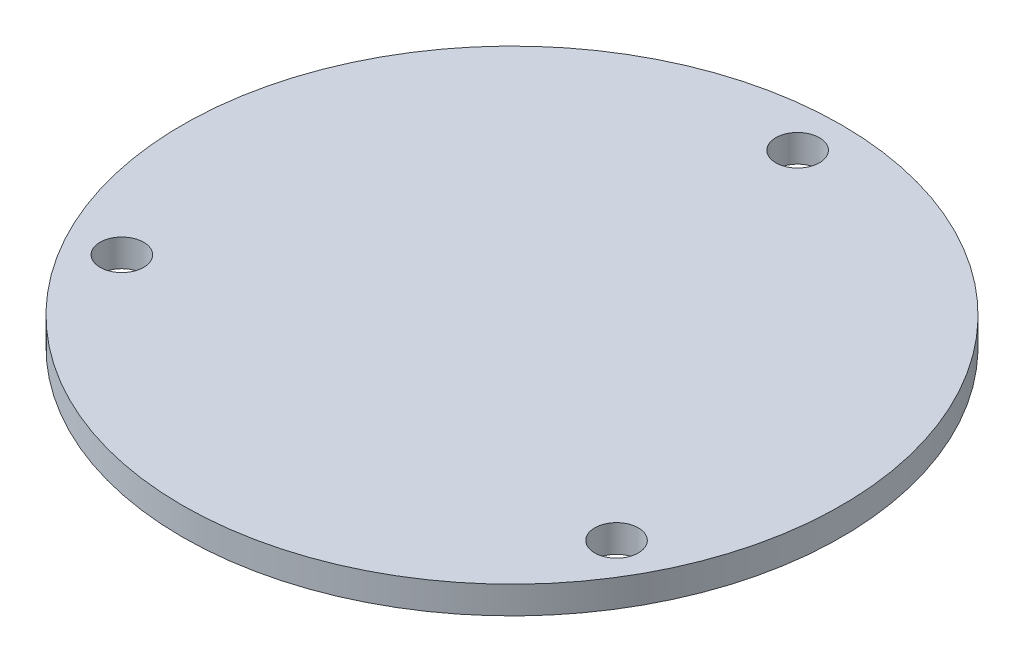
ISO-10303-21;
HEADER;
FILE_DESCRIPTION(('STEP AP214'),'2;1');
FILE_NAME('part.step','',(''),(''),'','','');
FILE_SCHEMA(('AUTOMOTIVE_DESIGN { 1 0 10303 214 1 1 1 1 }'));
ENDSEC;
DATA;
#1=APPLICATION_CONTEXT('core data for automotive mechanical design processes');
#2=APPLICATION_PROTOCOL_DEFINITION('international standard','automotive_design',2000,#1);
#3=PRODUCT_CONTEXT('',#1,'mechanical');
#4=PRODUCT('Part','Part','',(#3));
#5=PRODUCT_RELATED_PRODUCT_CATEGORY('part','',(#4));
#6=PRODUCT_DEFINITION_FORMATION('','',#4);
#7=PRODUCT_DEFINITION_CONTEXT('part definition',#1,'design');
#8=PRODUCT_DEFINITION('design','',#6,#7);
#9=PRODUCT_DEFINITION_SHAPE('','',#8);
#10=(LENGTH_UNIT() NAMED_UNIT(*) SI_UNIT(.MILLI.,.METRE.));
#11=(NAMED_UNIT(*) PLANE_ANGLE_UNIT() SI_UNIT($,.RADIAN.));
#12=(NAMED_UNIT(*) SI_UNIT($,.STERADIAN.) SOLID_ANGLE_UNIT());
#13=UNCERTAINTY_MEASURE_WITH_UNIT(LENGTH_MEASURE(1.E-05),#10,'distance_accuracy_value','');
#14=(GEOMETRIC_REPRESENTATION_CONTEXT(3) GLOBAL_UNCERTAINTY_ASSIGNED_CONTEXT((#13)) GLOBAL_UNIT_ASSIGNED_CONTEXT((#10,
#11,#12)) REPRESENTATION_CONTEXT('',''));
#15=CARTESIAN_POINT('',(0.,0.,0.));
#16=DIRECTION('',(0.,0.,1.));
#17=DIRECTION('',(1.,0.,0.));
#18=AXIS2_PLACEMENT_3D('',#15,#16,#17);
#19=CARTESIAN_POINT('',(19.05,1.5875,-19.05));
#20=DIRECTION('',(0.,1.,0.));
#21=DIRECTION('',(0.,0.,1.));
#22=AXIS2_PLACEMENT_3D('',#19,#20,#21);
#23=PLANE('',#22);
#24=CARTESIAN_POINT('',(4.75192058351891,1.5875,-10.795));
#25=DIRECTION('',(0.,1.,0.));
#26=DIRECTION('',(0.,0.,1.));
#27=AXIS2_PLACEMENT_3D('',#24,#25,#26);
#28=CIRCLE('',#27,1.25980165100016);
#29=CARTESIAN_POINT('',(4.75192058351891,1.5875,-9.53519834899987));
#30=VERTEX_POINT('',#29);
#31=EDGE_CURVE('E46',#30,#30,#28,.T.);
#32=ORIENTED_EDGE('',*,*,#31,.F.);
#33=EDGE_LOOP('',(#32));
#34=FACE_BOUND('',#33,.T.);
#35=CARTESIAN_POINT('',(19.05,1.5875,-19.05));
#36=DIRECTION('',(0.,1.,0.));
#37=DIRECTION('',(0.,0.,1.));
#38=AXIS2_PLACEMENT_3D('',#35,#36,#37);
#39=CIRCLE('',#38,19.05);
#40=CARTESIAN_POINT('',(19.05,1.5875,0.));
#41=VERTEX_POINT('',#40);
#42=EDGE_CURVE('E10',#41,#41,#39,.T.);
#43=ORIENTED_EDGE('',*,*,#42,.T.);
#44=EDGE_LOOP('',(#43));
#45=FACE_BOUND('',#44,.T.);
#46=CARTESIAN_POINT('',(19.05,1.5875,-35.56));
#47=DIRECTION('',(0.,1.,0.));
#48=DIRECTION('',(0.,0.,1.));
#49=AXIS2_PLACEMENT_3D('',#46,#47,#48);
#50=CIRCLE('',#49,1.25980165100016);
#51=CARTESIAN_POINT('',(19.05,1.5875,-34.3001983489998));
#52=VERTEX_POINT('',#51);
#53=EDGE_CURVE('E41',#52,#52,#50,.T.);
#54=ORIENTED_EDGE('',*,*,#53,.F.);
#55=EDGE_LOOP('',(#54));
#56=FACE_BOUND('',#55,.T.);
#57=CARTESIAN_POINT('',(33.3480794164811,1.5875,-10.795));
#58=DIRECTION('',(0.,1.,0.));
#59=DIRECTION('',(0.,0.,1.));
#60=AXIS2_PLACEMENT_3D('',#57,#58,#59);
#61=CIRCLE('',#60,1.25980165100017);
#62=CARTESIAN_POINT('',(33.3480794164811,1.5875,-9.53519834899988));
#63=VERTEX_POINT('',#62);
#64=EDGE_CURVE('E52',#63,#63,#61,.T.);
#65=ORIENTED_EDGE('',*,*,#64,.F.);
#66=EDGE_LOOP('',(#65));
#67=FACE_BOUND('',#66,.T.);
#68=ADVANCED_FACE('F30',(#34,#45,#56,#67),#23,.T.);
#69=CARTESIAN_POINT('',(19.05,0.,-19.05));
#70=DIRECTION('',(0.,1.,0.));
#71=DIRECTION('',(0.,0.,1.));
#72=AXIS2_PLACEMENT_3D('',#69,#70,#71);
#73=PLANE('',#72);
#74=CARTESIAN_POINT('',(19.05,0.,-19.05));
#75=DIRECTION('',(0.,1.,0.));
#76=DIRECTION('',(0.,0.,1.));
#77=AXIS2_PLACEMENT_3D('',#74,#75,#76);
#78=CIRCLE('',#77,19.05);
#79=CARTESIAN_POINT('',(19.05,0.,0.));
#80=VERTEX_POINT('',#79);
#81=EDGE_CURVE('E34',#80,#80,#78,.T.);
#82=ORIENTED_EDGE('',*,*,#81,.F.);
#83=EDGE_LOOP('',(#82));
#84=FACE_BOUND('',#83,.T.);
#85=CARTESIAN_POINT('',(19.05,0.,-35.56));
#86=DIRECTION('',(0.,1.,0.));
#87=DIRECTION('',(0.,0.,1.));
#88=AXIS2_PLACEMENT_3D('',#85,#86,#87);
#89=CIRCLE('',#88,1.25980165100016);
#90=CARTESIAN_POINT('',(19.05,0.,-34.3001983489998));
#91=VERTEX_POINT('',#90);
#92=EDGE_CURVE('E43',#91,#91,#89,.T.);
#93=ORIENTED_EDGE('',*,*,#92,.T.);
#94=EDGE_LOOP('',(#93));
#95=FACE_BOUND('',#94,.T.);
#96=CARTESIAN_POINT('',(4.75192058351891,0.,-10.795));
#97=DIRECTION('',(0.,1.,0.));
#98=DIRECTION('',(0.,0.,1.));
#99=AXIS2_PLACEMENT_3D('',#96,#97,#98);
#100=CIRCLE('',#99,1.25980165100016);
#101=CARTESIAN_POINT('',(4.75192058351891,0.,-9.53519834899987));
#102=VERTEX_POINT('',#101);
#103=EDGE_CURVE('E49',#102,#102,#100,.T.);
#104=ORIENTED_EDGE('',*,*,#103,.T.);
#105=EDGE_LOOP('',(#104));
#106=FACE_BOUND('',#105,.T.);
#107=CARTESIAN_POINT('',(33.3480794164811,0.,-10.795));
#108=DIRECTION('',(0.,1.,0.));
#109=DIRECTION('',(0.,0.,1.));
#110=AXIS2_PLACEMENT_3D('',#107,#108,#109);
#111=CIRCLE('',#110,1.25980165100017);
#112=CARTESIAN_POINT('',(33.3480794164811,0.,-9.53519834899988));
#113=VERTEX_POINT('',#112);
#114=EDGE_CURVE('E55',#113,#113,#111,.T.);
#115=ORIENTED_EDGE('',*,*,#114,.T.);
#116=EDGE_LOOP('',(#115));
#117=FACE_BOUND('',#116,.T.);
#118=ADVANCED_FACE('F65',(#84,#95,#106,#117),#73,.F.);
#119=CARTESIAN_POINT('',(19.05,1.5875,-19.05));
#120=DIRECTION('',(0.,-1.,0.));
#121=DIRECTION('',(0.,0.,-1.));
#122=AXIS2_PLACEMENT_3D('',#119,#120,#121);
#123=CYLINDRICAL_SURFACE('',#122,19.05);
#124=ORIENTED_EDGE('',*,*,#42,.F.);
#125=EDGE_LOOP('',(#124));
#126=FACE_BOUND('',#125,.T.);
#127=ORIENTED_EDGE('',*,*,#81,.T.);
#128=EDGE_LOOP('',(#127));
#129=FACE_BOUND('',#128,.T.);
#130=ADVANCED_FACE('F32',(#126,#129),#123,.T.);
#131=CARTESIAN_POINT('',(19.05,1.5875,-35.56));
#132=DIRECTION('',(0.,-1.,0.));
#133=DIRECTION('',(0.,0.,-1.));
#134=AXIS2_PLACEMENT_3D('',#131,#132,#133);
#135=CYLINDRICAL_SURFACE('',#134,1.25980165100016);
#136=ORIENTED_EDGE('',*,*,#53,.T.);
#137=EDGE_LOOP('',(#136));
#138=FACE_BOUND('',#137,.T.);
#139=ORIENTED_EDGE('',*,*,#92,.F.);
#140=EDGE_LOOP('',(#139));
#141=FACE_BOUND('',#140,.T.);
#142=ADVANCED_FACE('F74',(#138,#141),#135,.F.);
#143=CARTESIAN_POINT('',(4.75192058351891,1.5875,-10.795));
#144=DIRECTION('',(0.,-1.,0.));
#145=DIRECTION('',(0.,0.,-1.));
#146=AXIS2_PLACEMENT_3D('',#143,#144,#145);
#147=CYLINDRICAL_SURFACE('',#146,1.25980165100016);
#148=ORIENTED_EDGE('',*,*,#31,.T.);
#149=EDGE_LOOP('',(#148));
#150=FACE_BOUND('',#149,.T.);
#151=ORIENTED_EDGE('',*,*,#103,.F.);
#152=EDGE_LOOP('',(#151));
#153=FACE_BOUND('',#152,.T.);
#154=ADVANCED_FACE('F77',(#150,#153),#147,.F.);
#155=CARTESIAN_POINT('',(33.3480794164811,1.5875,-10.795));
#156=DIRECTION('',(0.,-1.,0.));
#157=DIRECTION('',(0.,0.,-1.));
#158=AXIS2_PLACEMENT_3D('',#155,#156,#157);
#159=CYLINDRICAL_SURFACE('',#158,1.25980165100017);
#160=ORIENTED_EDGE('',*,*,#64,.T.);
#161=EDGE_LOOP('',(#160));
#162=FACE_BOUND('',#161,.T.);
#163=ORIENTED_EDGE('',*,*,#114,.F.);
#164=EDGE_LOOP('',(#163));
#165=FACE_BOUND('',#164,.T.);
#166=ADVANCED_FACE('F61',(#162,#165),#159,.F.);
#167=CLOSED_SHELL('',(#68,#118,#130,#142,#154,#166));
#168=MANIFOLD_SOLID_BREP('B2',#167);
#169=ADVANCED_BREP_SHAPE_REPRESENTATION('',(#18,#168),#14);
#170=SHAPE_DEFINITION_REPRESENTATION(#9,#169);
ENDSEC;
END-ISO-10303-21;
